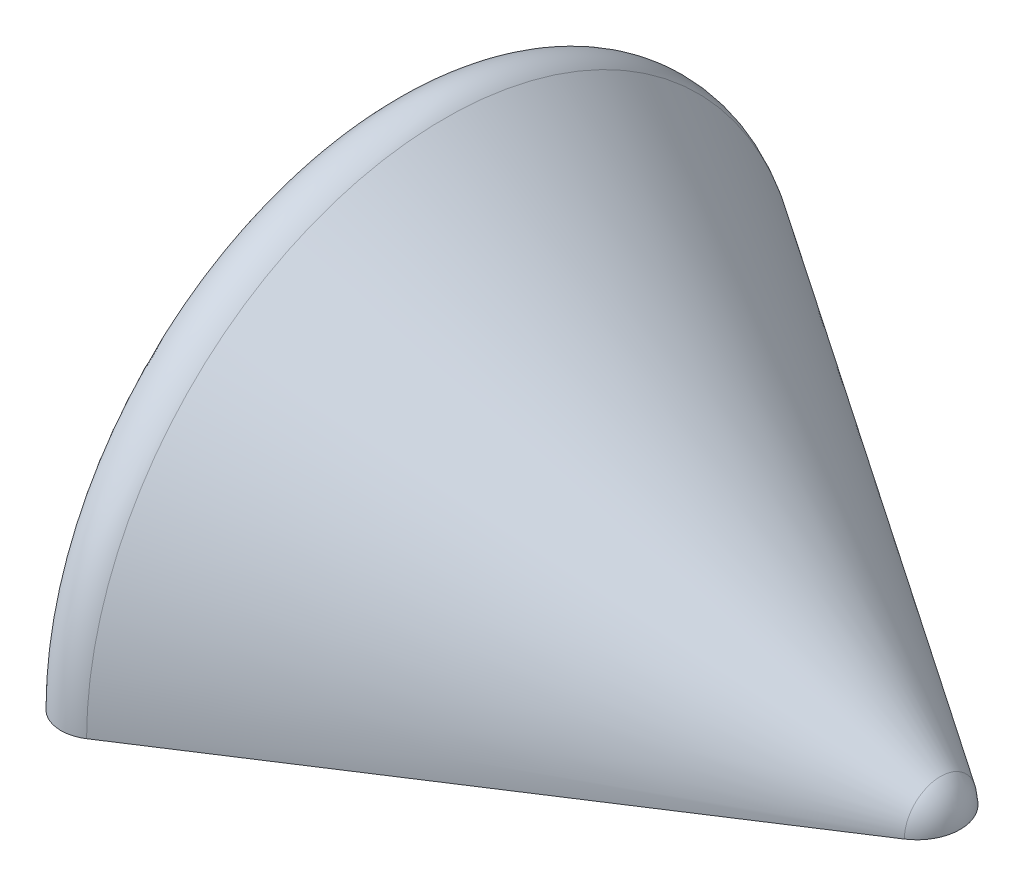
ISO-10303-21;
HEADER;
FILE_DESCRIPTION(('STEP AP214'),'2;1');
FILE_NAME('part.step','',(''),(''),'','','');
FILE_SCHEMA(('AUTOMOTIVE_DESIGN { 1 0 10303 214 1 1 1 1 }'));
ENDSEC;
DATA;
#1=APPLICATION_CONTEXT('core data for automotive mechanical design processes');
#2=APPLICATION_PROTOCOL_DEFINITION('international standard','automotive_design',2000,#1);
#3=PRODUCT_CONTEXT('',#1,'mechanical');
#4=PRODUCT('Part','Part','',(#3));
#5=PRODUCT_RELATED_PRODUCT_CATEGORY('part','',(#4));
#6=PRODUCT_DEFINITION_FORMATION('','',#4);
#7=PRODUCT_DEFINITION_CONTEXT('part definition',#1,'design');
#8=PRODUCT_DEFINITION('design','',#6,#7);
#9=PRODUCT_DEFINITION_SHAPE('','',#8);
#10=(LENGTH_UNIT() NAMED_UNIT(*) SI_UNIT(.MILLI.,.METRE.));
#11=(NAMED_UNIT(*) PLANE_ANGLE_UNIT() SI_UNIT($,.RADIAN.));
#12=(NAMED_UNIT(*) SI_UNIT($,.STERADIAN.) SOLID_ANGLE_UNIT());
#13=UNCERTAINTY_MEASURE_WITH_UNIT(LENGTH_MEASURE(1.E-05),#10,'distance_accuracy_value','');
#14=(GEOMETRIC_REPRESENTATION_CONTEXT(3) GLOBAL_UNCERTAINTY_ASSIGNED_CONTEXT((#13)) GLOBAL_UNIT_ASSIGNED_CONTEXT((#10,
#11,#12)) REPRESENTATION_CONTEXT('',''));
#15=CARTESIAN_POINT('',(0.,0.,0.));
#16=DIRECTION('',(0.,0.,1.));
#17=DIRECTION('',(1.,0.,0.));
#18=AXIS2_PLACEMENT_3D('',#15,#16,#17);
#19=CARTESIAN_POINT('',(102336.470299082,-0.0118645191385923,50800.));
#20=DIRECTION('',(-0.999999999870138,1.61159484267787E-05,0.));
#21=DIRECTION('',(-1.61159484267787E-05,-0.999999999870138,0.));
#22=AXIS2_PLACEMENT_3D('',#19,#20,#21);
#23=TOROIDAL_SURFACE('',#22,1766.70275000699,195.580000000006);
#24=CARTESIAN_POINT('',(102162.852748177,-0.0090665076418614,50800.));
#25=DIRECTION('',(-0.999999999870138,1.61159484267787E-05,0.));
#26=DIRECTION('',(-1.61159484267787E-05,-0.999999999870138,0.));
#27=AXIS2_PLACEMENT_3D('',#24,#25,#26);
#28=CIRCLE('',#27,1856.74986217582);
#29=CARTESIAN_POINT('',(102162.852748177,-0.00906650764537567,52656.7498621758));
#30=VERTEX_POINT('',#29);
#31=CARTESIAN_POINT('',(102162.852748177,-0.00906650765131189,48943.2501378242));
#32=VERTEX_POINT('',#31);
#33=EDGE_CURVE('E11',#30,#32,#28,.T.);
#34=ORIENTED_EDGE('',*,*,#33,.F.);
#35=CARTESIAN_POINT('',(102336.470299082,-0.0118645191445987,52566.702750007));
#36=DIRECTION('',(-1.61159484267787E-05,-0.999999999870138,0.));
#37=DIRECTION('',(0.999999999740276,-1.61159484246859E-05,1.61159484267787E-05));
#38=AXIS2_PLACEMENT_3D('',#35,#36,#37);
#39=CIRCLE('',#38,195.580000000006);
#40=CARTESIAN_POINT('',(102442.990801536,-0.013581198070631,52730.7299396858));
#41=VERTEX_POINT('',#40);
#42=EDGE_CURVE('E91',#41,#30,#39,.T.);
#43=ORIENTED_EDGE('',*,*,#42,.F.);
#44=CARTESIAN_POINT('',(102442.990801536,-0.0135811980627649,50800.));
#45=DIRECTION('',(-0.999999999870138,1.61159484267787E-05,0.));
#46=DIRECTION('',(-1.61159484267787E-05,-0.999999999870138,0.));
#47=AXIS2_PLACEMENT_3D('',#44,#45,#46);
#48=CIRCLE('',#47,1930.72993968576);
#49=CARTESIAN_POINT('',(102442.990801536,-0.0135811980683798,48869.2700603142));
#50=VERTEX_POINT('',#49);
#51=EDGE_CURVE('E47',#41,#50,#48,.T.);
#52=ORIENTED_EDGE('',*,*,#51,.T.);
#53=CARTESIAN_POINT('',(102336.470299082,-0.0118645191449218,49033.297249993));
#54=DIRECTION('',(1.61159484267787E-05,0.999999999870138,0.));
#55=DIRECTION('',(0.999999999740276,-1.61159484246859E-05,-1.61159484267787E-05));
#56=AXIS2_PLACEMENT_3D('',#53,#54,#55);
#57=CIRCLE('',#56,195.580000000006);
#58=EDGE_CURVE('E80',#50,#32,#57,.T.);
#59=ORIENTED_EDGE('',*,*,#58,.T.);
#60=EDGE_LOOP('',(#34,#43,#52,#59));
#61=FACE_BOUND('',#60,.T.);
#62=ADVANCED_FACE('F32',(#61),#23,.T.);
#63=CARTESIAN_POINT('',(106862.8599739,580.82921815219,50800.));
#64=DIRECTION('',(0.,0.,-1.));
#65=DIRECTION('',(-1.61159484267787E-05,-0.999999999870138,0.));
#66=AXIS2_PLACEMENT_3D('',#63,#64,#65);
#67=CIRCLE('',#66,5294.54296181187);
#68=TRIMMED_CURVE('',#67,(PARAMETER_VALUE(-1.46085559459802)),
(PARAMETER_VALUE(1.46085559459802)),.T.,.PARAMETER.);
#69=CARTESIAN_POINT('',(106862.850611919,-0.0848114308297379,50800.));
#70=DIRECTION('',(-0.999999999870138,1.61159484267787E-05,0.));
#71=AXIS1_PLACEMENT('',#69,#70);
#72=SURFACE_OF_REVOLUTION('',#68,#71);
#73=CARTESIAN_POINT('',(106862.850611919,-0.0848114308240611,51380.9140296585));
#74=DIRECTION('',(1.61159484267787E-05,0.999999999870138,0.));
#75=DIRECTION('',(0.999999999740276,-1.61159484246859E-05,-1.61159484267787E-05));
#76=AXIS2_PLACEMENT_3D('',#73,#74,#75);
#77=CIRCLE('',#76,5294.54296181187);
#78=CARTESIAN_POINT('',(101600.272911075,0.,50800.));
#79=VERTEX_POINT('',#78);
#80=EDGE_CURVE('E74',#32,#79,#77,.T.);
#81=ORIENTED_EDGE('',*,*,#80,.T.);
#82=CARTESIAN_POINT('',(106862.850611919,-0.0848114308313569,50219.0859703415));
#83=DIRECTION('',(-1.61159484267787E-05,-0.999999999870138,0.));
#84=DIRECTION('',(0.999999999740276,-1.61159484246859E-05,1.61159484267787E-05));
#85=AXIS2_PLACEMENT_3D('',#82,#83,#84);
#86=CIRCLE('',#85,5294.54296181187);
#87=EDGE_CURVE('E76',#30,#79,#86,.T.);
#88=ORIENTED_EDGE('',*,*,#87,.F.);
#89=ORIENTED_EDGE('',*,*,#33,.T.);
#90=EDGE_LOOP('',(#81,#88,#89));
#91=FACE_BOUND('',#90,.T.);
#92=ADVANCED_FACE('F34',(#91),#72,.T.);
#93=CARTESIAN_POINT('',(104989.013916168,-0.109225550578032,50800.));
#94=DIRECTION('',(0.,0.,-1.));
#95=DIRECTION('',(-1.61159484267787E-05,-0.999999999870138,0.));
#96=AXIS2_PLACEMENT_3D('',#93,#94,#95);
#97=CIRCLE('',#96,232.537000000009);
#98=TRIMMED_CURVE('',#97,(PARAMETER_VALUE(-1.57103118307926)),
(PARAMETER_VALUE(1.57103118307926)),.T.,.PARAMETER.);
#99=CARTESIAN_POINT('',(104989.013917048,-0.0546127752910636,50800.));
#100=DIRECTION('',(-0.999999999870138,1.61159484267787E-05,0.));
#101=AXIS1_PLACEMENT('',#99,#100);
#102=SURFACE_OF_REVOLUTION('',#98,#101);
#103=CARTESIAN_POINT('',(105115.662644317,-0.0566538396483105,50800.));
#104=DIRECTION('',(-0.999999999870138,1.61159484267787E-05,0.));
#105=DIRECTION('',(-1.61159484267787E-05,-0.999999999870138,0.));
#106=AXIS2_PLACEMENT_3D('',#103,#104,#105);
#107=CIRCLE('',#106,195.07655063363);
#108=CARTESIAN_POINT('',(105115.662644317,-0.0566538396481703,50995.0765506336));
#109=VERTEX_POINT('',#108);
#110=CARTESIAN_POINT('',(105115.662644316,-0.0566538396498117,50604.9234493664));
#111=VERTEX_POINT('',#110);
#112=EDGE_CURVE('E40',#109,#111,#107,.T.);
#113=ORIENTED_EDGE('',*,*,#112,.F.);
#114=CARTESIAN_POINT('',(104989.013917048,-0.0546127752880658,50800.0546127753));
#115=DIRECTION('',(-1.61159484267787E-05,-0.999999999870138,0.));
#116=DIRECTION('',(0.999999999740276,-1.61159484246859E-05,1.61159484267787E-05));
#117=AXIS2_PLACEMENT_3D('',#114,#115,#116);
#118=CIRCLE('',#117,232.537000000009);
#119=CARTESIAN_POINT('',(105221.550910604,-0.0583603294841413,50800.));
#120=VERTEX_POINT('',#119);
#121=EDGE_CURVE('E94',#120,#109,#118,.T.);
#122=ORIENTED_EDGE('',*,*,#121,.F.);
#123=CARTESIAN_POINT('',(104989.013917048,-0.0546127752940606,50799.9453872247));
#124=DIRECTION('',(1.61159484267787E-05,0.999999999870138,0.));
#125=DIRECTION('',(0.999999999740276,-1.61159484246859E-05,-1.61159484267787E-05));
#126=AXIS2_PLACEMENT_3D('',#123,#124,#125);
#127=CIRCLE('',#126,232.537000000009);
#128=EDGE_CURVE('E85',#120,#111,#127,.T.);
#129=ORIENTED_EDGE('',*,*,#128,.T.);
#130=EDGE_LOOP('',(#113,#122,#129));
#131=FACE_BOUND('',#130,.T.);
#132=ADVANCED_FACE('F100',(#131),#102,.T.);
#133=CARTESIAN_POINT('',(105115.662644317,-0.0566538396483105,50800.));
#134=DIRECTION('',(-0.999999999870138,1.61159484267787E-05,0.));
#135=DIRECTION('',(-1.61159484267787E-05,-0.999999999870138,0.));
#136=AXIS2_PLACEMENT_3D('',#133,#134,#135);
#137=CONICAL_SURFACE('',#136,195.07655063363,0.575958653158123);
#138=DIRECTION('',(-0.838670567836514,1.35159716181641E-05,0.544639035015025));
#139=VECTOR('',#138,1.);
#140=CARTESIAN_POINT('',(105115.662644317,-0.0566538396481703,50995.0765506336));
#141=LINE('',#140,#139);
#142=EDGE_CURVE('E96',#109,#41,#141,.T.);
#143=ORIENTED_EDGE('',*,*,#142,.F.);
#144=ORIENTED_EDGE('',*,*,#112,.T.);
#145=DIRECTION('',(-0.838670567836514,1.35159716181641E-05,-0.544639035015025));
#146=VECTOR('',#145,1.);
#147=CARTESIAN_POINT('',(105115.662644316,-0.0566538396498117,50604.9234493664));
#148=LINE('',#147,#146);
#149=EDGE_CURVE('E87',#111,#50,#148,.T.);
#150=ORIENTED_EDGE('',*,*,#149,.T.);
#151=ORIENTED_EDGE('',*,*,#51,.F.);
#152=EDGE_LOOP('',(#143,#144,#150,#151));
#153=FACE_BOUND('',#152,.T.);
#154=ADVANCED_FACE('F99',(#153),#137,.T.);
#155=CARTESIAN_POINT('',(102336.470299082,-0.0118645191445987,52566.702750007));
#156=DIRECTION('',(-1.61159484267787E-05,-0.999999999870138,0.));
#157=DIRECTION('',(0.999999999740276,-1.61159484246859E-05,1.61159484267787E-05));
#158=AXIS2_PLACEMENT_3D('',#155,#156,#157);
#159=PLANE('',#158);
#160=ORIENTED_EDGE('',*,*,#42,.T.);
#161=ORIENTED_EDGE('',*,*,#87,.T.);
#162=ORIENTED_EDGE('',*,*,#80,.F.);
#163=ORIENTED_EDGE('',*,*,#58,.F.);
#164=ORIENTED_EDGE('',*,*,#149,.F.);
#165=ORIENTED_EDGE('',*,*,#128,.F.);
#166=ORIENTED_EDGE('',*,*,#121,.T.);
#167=ORIENTED_EDGE('',*,*,#142,.T.);
#168=EDGE_LOOP('',(#160,#161,#162,#163,#164,#165,#166,#167));
#169=FACE_BOUND('',#168,.T.);
#170=ADVANCED_FACE('F84',(#169),#159,.T.);
#171=CLOSED_SHELL('',(#62,#92,#132,#154,#170));
#172=MANIFOLD_SOLID_BREP('B2',#171);
#173=ADVANCED_BREP_SHAPE_REPRESENTATION('',(#18,#172),#14);
#174=SHAPE_DEFINITION_REPRESENTATION(#9,#173);
ENDSEC;
END-ISO-10303-21;
